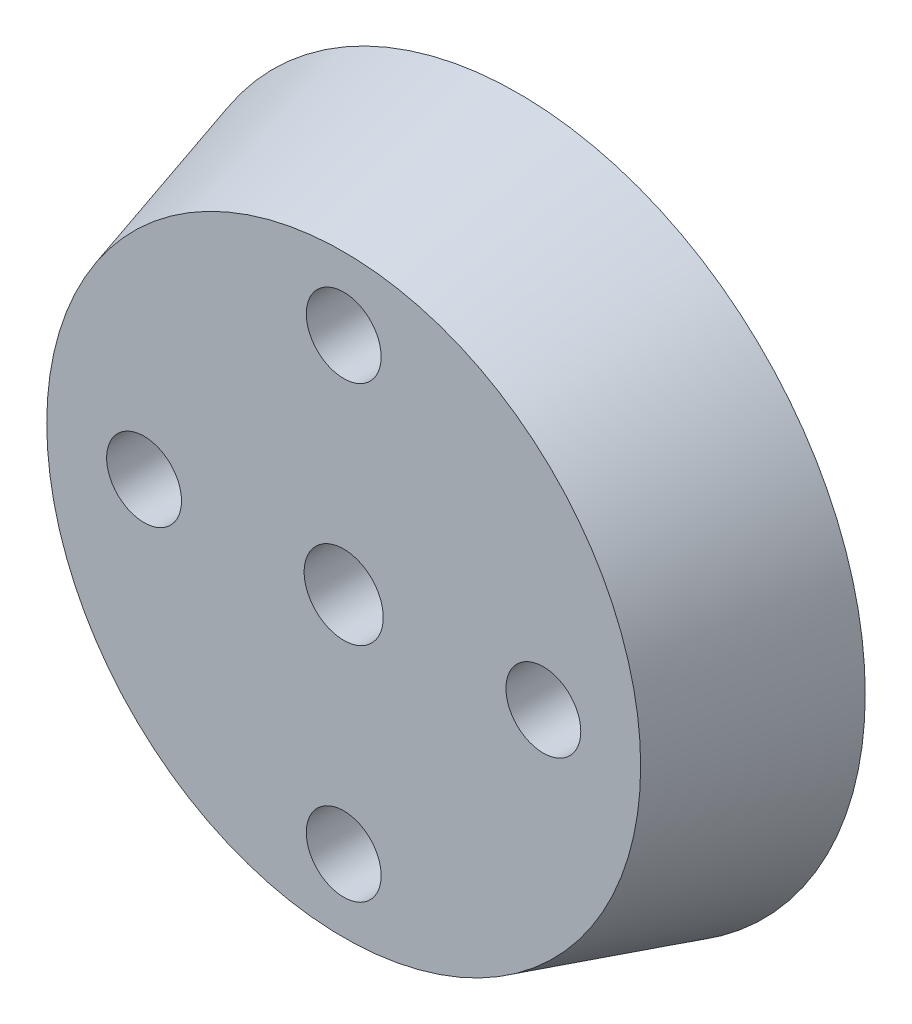
ISO-10303-21;
HEADER;
FILE_DESCRIPTION(('STEP AP214'),'2;1');
FILE_NAME('part.step','',(''),(''),'','','');
FILE_SCHEMA(('AUTOMOTIVE_DESIGN { 1 0 10303 214 1 1 1 1 }'));
ENDSEC;
DATA;
#1=APPLICATION_CONTEXT('core data for automotive mechanical design processes');
#2=APPLICATION_PROTOCOL_DEFINITION('international standard','automotive_design',2000,#1);
#3=PRODUCT_CONTEXT('',#1,'mechanical');
#4=PRODUCT('Part','Part','',(#3));
#5=PRODUCT_RELATED_PRODUCT_CATEGORY('part','',(#4));
#6=PRODUCT_DEFINITION_FORMATION('','',#4);
#7=PRODUCT_DEFINITION_CONTEXT('part definition',#1,'design');
#8=PRODUCT_DEFINITION('design','',#6,#7);
#9=PRODUCT_DEFINITION_SHAPE('','',#8);
#10=(LENGTH_UNIT() NAMED_UNIT(*) SI_UNIT(.MILLI.,.METRE.));
#11=(NAMED_UNIT(*) PLANE_ANGLE_UNIT() SI_UNIT($,.RADIAN.));
#12=(NAMED_UNIT(*) SI_UNIT($,.STERADIAN.) SOLID_ANGLE_UNIT());
#13=UNCERTAINTY_MEASURE_WITH_UNIT(LENGTH_MEASURE(1.E-05),#10,'distance_accuracy_value','');
#14=(GEOMETRIC_REPRESENTATION_CONTEXT(3) GLOBAL_UNCERTAINTY_ASSIGNED_CONTEXT((#13)) GLOBAL_UNIT_ASSIGNED_CONTEXT((#10,
#11,#12)) REPRESENTATION_CONTEXT('',''));
#15=CARTESIAN_POINT('',(0.,0.,0.));
#16=DIRECTION('',(0.,0.,1.));
#17=DIRECTION('',(1.,0.,0.));
#18=AXIS2_PLACEMENT_3D('',#15,#16,#17);
#19=CARTESIAN_POINT('',(0.,0.,7.));
#20=DIRECTION('',(0.,0.,1.));
#21=DIRECTION('',(1.,0.,0.));
#22=AXIS2_PLACEMENT_3D('',#19,#20,#21);
#23=PLANE('',#22);
#24=CARTESIAN_POINT('',(0.,0.,7.));
#25=DIRECTION('',(0.,0.,1.));
#26=DIRECTION('',(1.,0.,0.));
#27=AXIS2_PLACEMENT_3D('',#24,#25,#26);
#28=CIRCLE('',#27,11.9);
#29=CARTESIAN_POINT('',(11.9,0.,7.));
#30=VERTEX_POINT('',#29);
#31=EDGE_CURVE('E10',#30,#30,#28,.T.);
#32=ORIENTED_EDGE('',*,*,#31,.T.);
#33=EDGE_LOOP('',(#32));
#34=FACE_BOUND('',#33,.T.);
#35=CARTESIAN_POINT('',(-8.,0.,7.));
#36=DIRECTION('',(0.,0.,1.));
#37=DIRECTION('',(1.,0.,0.));
#38=AXIS2_PLACEMENT_3D('',#35,#36,#37);
#39=CIRCLE('',#38,1.5);
#40=CARTESIAN_POINT('',(-6.5,0.,7.));
#41=VERTEX_POINT('',#40);
#42=EDGE_CURVE('E81',#41,#41,#39,.T.);
#43=ORIENTED_EDGE('',*,*,#42,.F.);
#44=EDGE_LOOP('',(#43));
#45=FACE_BOUND('',#44,.T.);
#46=CARTESIAN_POINT('',(8.,0.,7.));
#47=DIRECTION('',(0.,0.,1.));
#48=DIRECTION('',(1.,0.,0.));
#49=AXIS2_PLACEMENT_3D('',#46,#47,#48);
#50=CIRCLE('',#49,1.5);
#51=CARTESIAN_POINT('',(9.5,0.,7.));
#52=VERTEX_POINT('',#51);
#53=EDGE_CURVE('E78',#52,#52,#50,.T.);
#54=ORIENTED_EDGE('',*,*,#53,.F.);
#55=EDGE_LOOP('',(#54));
#56=FACE_BOUND('',#55,.T.);
#57=CARTESIAN_POINT('',(0.,-9.,7.));
#58=DIRECTION('',(0.,0.,1.));
#59=DIRECTION('',(1.,0.,0.));
#60=AXIS2_PLACEMENT_3D('',#57,#58,#59);
#61=CIRCLE('',#60,1.5);
#62=CARTESIAN_POINT('',(1.5,-9.,7.));
#63=VERTEX_POINT('',#62);
#64=EDGE_CURVE('E72',#63,#63,#61,.T.);
#65=ORIENTED_EDGE('',*,*,#64,.F.);
#66=EDGE_LOOP('',(#65));
#67=FACE_BOUND('',#66,.T.);
#68=CARTESIAN_POINT('',(0.,9.,7.));
#69=DIRECTION('',(0.,0.,1.));
#70=DIRECTION('',(1.,0.,0.));
#71=AXIS2_PLACEMENT_3D('',#68,#69,#70);
#72=CIRCLE('',#71,1.5);
#73=CARTESIAN_POINT('',(1.5,9.,7.));
#74=VERTEX_POINT('',#73);
#75=EDGE_CURVE('E65',#74,#74,#72,.T.);
#76=ORIENTED_EDGE('',*,*,#75,.F.);
#77=EDGE_LOOP('',(#76));
#78=FACE_BOUND('',#77,.T.);
#79=CARTESIAN_POINT('',(0.,0.,7.));
#80=DIRECTION('',(0.,0.,1.));
#81=DIRECTION('',(1.,0.,0.));
#82=AXIS2_PLACEMENT_3D('',#79,#80,#81);
#83=CIRCLE('',#82,1.585);
#84=CARTESIAN_POINT('',(1.585,0.,7.));
#85=VERTEX_POINT('',#84);
#86=EDGE_CURVE('E59',#85,#85,#83,.T.);
#87=ORIENTED_EDGE('',*,*,#86,.F.);
#88=EDGE_LOOP('',(#87));
#89=FACE_BOUND('',#88,.T.);
#90=ADVANCED_FACE('F43',(#34,#45,#56,#67,#78,#89),#23,.T.);
#91=CARTESIAN_POINT('',(0.,0.,0.));
#92=DIRECTION('',(0.,0.,1.));
#93=DIRECTION('',(1.,0.,0.));
#94=AXIS2_PLACEMENT_3D('',#91,#92,#93);
#95=PLANE('',#94);
#96=CARTESIAN_POINT('',(-8.,0.,0.));
#97=DIRECTION('',(0.,0.,1.));
#98=DIRECTION('',(1.,0.,0.));
#99=AXIS2_PLACEMENT_3D('',#96,#97,#98);
#100=CIRCLE('',#99,1.5);
#101=CARTESIAN_POINT('',(-6.5,0.,0.));
#102=VERTEX_POINT('',#101);
#103=EDGE_CURVE('E64',#102,#102,#100,.F.);
#104=ORIENTED_EDGE('',*,*,#103,.F.);
#105=EDGE_LOOP('',(#104));
#106=FACE_BOUND('',#105,.T.);
#107=CARTESIAN_POINT('',(8.,0.,0.));
#108=DIRECTION('',(0.,0.,1.));
#109=DIRECTION('',(1.,0.,0.));
#110=AXIS2_PLACEMENT_3D('',#107,#108,#109);
#111=CIRCLE('',#110,1.5);
#112=CARTESIAN_POINT('',(9.5,0.,0.));
#113=VERTEX_POINT('',#112);
#114=EDGE_CURVE('E75',#113,#113,#111,.F.);
#115=ORIENTED_EDGE('',*,*,#114,.F.);
#116=EDGE_LOOP('',(#115));
#117=FACE_BOUND('',#116,.T.);
#118=CARTESIAN_POINT('',(0.,-9.,0.));
#119=DIRECTION('',(0.,0.,1.));
#120=DIRECTION('',(1.,0.,0.));
#121=AXIS2_PLACEMENT_3D('',#118,#119,#120);
#122=CIRCLE('',#121,1.5);
#123=CARTESIAN_POINT('',(1.5,-9.,0.));
#124=VERTEX_POINT('',#123);
#125=EDGE_CURVE('E68',#124,#124,#122,.F.);
#126=ORIENTED_EDGE('',*,*,#125,.F.);
#127=EDGE_LOOP('',(#126));
#128=FACE_BOUND('',#127,.T.);
#129=CARTESIAN_POINT('',(0.,9.,0.));
#130=DIRECTION('',(0.,0.,1.));
#131=DIRECTION('',(1.,0.,0.));
#132=AXIS2_PLACEMENT_3D('',#129,#130,#131);
#133=CIRCLE('',#132,1.5);
#134=CARTESIAN_POINT('',(1.5,9.,0.));
#135=VERTEX_POINT('',#134);
#136=EDGE_CURVE('E69',#135,#135,#133,.F.);
#137=ORIENTED_EDGE('',*,*,#136,.F.);
#138=EDGE_LOOP('',(#137));
#139=FACE_BOUND('',#138,.T.);
#140=CARTESIAN_POINT('',(0.,0.,0.));
#141=DIRECTION('',(0.,0.,1.));
#142=DIRECTION('',(1.,0.,0.));
#143=AXIS2_PLACEMENT_3D('',#140,#141,#142);
#144=CIRCLE('',#143,1.585);
#145=CARTESIAN_POINT('',(1.585,0.,0.));
#146=VERTEX_POINT('',#145);
#147=EDGE_CURVE('E55',#146,#146,#144,.F.);
#148=ORIENTED_EDGE('',*,*,#147,.F.);
#149=EDGE_LOOP('',(#148));
#150=FACE_BOUND('',#149,.T.);
#151=CARTESIAN_POINT('',(0.,0.,0.));
#152=DIRECTION('',(0.,0.,1.));
#153=DIRECTION('',(1.,0.,0.));
#154=AXIS2_PLACEMENT_3D('',#151,#152,#153);
#155=CIRCLE('',#154,13.9);
#156=CARTESIAN_POINT('',(13.9,0.,0.));
#157=VERTEX_POINT('',#156);
#158=EDGE_CURVE('E51',#157,#157,#155,.T.);
#159=ORIENTED_EDGE('',*,*,#158,.F.);
#160=EDGE_LOOP('',(#159));
#161=FACE_BOUND('',#160,.T.);
#162=ADVANCED_FACE('F94',(#106,#117,#128,#139,#150,#161),#95,.F.);
#163=CARTESIAN_POINT('',(0.,0.,-0.00100000000000013));
#164=DIRECTION('',(0.,0.,1.));
#165=DIRECTION('',(1.,0.,0.));
#166=AXIS2_PLACEMENT_3D('',#163,#164,#165);
#167=CYLINDRICAL_SURFACE('',#166,1.585);
#168=ORIENTED_EDGE('',*,*,#86,.T.);
#169=EDGE_LOOP('',(#168));
#170=FACE_BOUND('',#169,.T.);
#171=ORIENTED_EDGE('',*,*,#147,.T.);
#172=EDGE_LOOP('',(#171));
#173=FACE_BOUND('',#172,.T.);
#174=ADVANCED_FACE('F104',(#170,#173),#167,.F.);
#175=CARTESIAN_POINT('',(0.,9.,-0.00100000000000013));
#176=DIRECTION('',(0.,0.,1.));
#177=DIRECTION('',(1.,0.,0.));
#178=AXIS2_PLACEMENT_3D('',#175,#176,#177);
#179=CYLINDRICAL_SURFACE('',#178,1.5);
#180=ORIENTED_EDGE('',*,*,#75,.T.);
#181=EDGE_LOOP('',(#180));
#182=FACE_BOUND('',#181,.T.);
#183=ORIENTED_EDGE('',*,*,#136,.T.);
#184=EDGE_LOOP('',(#183));
#185=FACE_BOUND('',#184,.T.);
#186=ADVANCED_FACE('F107',(#182,#185),#179,.F.);
#187=CARTESIAN_POINT('',(0.,-9.,-0.00100000000000013));
#188=DIRECTION('',(0.,0.,1.));
#189=DIRECTION('',(1.,0.,0.));
#190=AXIS2_PLACEMENT_3D('',#187,#188,#189);
#191=CYLINDRICAL_SURFACE('',#190,1.5);
#192=ORIENTED_EDGE('',*,*,#64,.T.);
#193=EDGE_LOOP('',(#192));
#194=FACE_BOUND('',#193,.T.);
#195=ORIENTED_EDGE('',*,*,#125,.T.);
#196=EDGE_LOOP('',(#195));
#197=FACE_BOUND('',#196,.T.);
#198=ADVANCED_FACE('F121',(#194,#197),#191,.F.);
#199=CARTESIAN_POINT('',(8.,0.,-0.00100000000000013));
#200=DIRECTION('',(0.,0.,1.));
#201=DIRECTION('',(1.,0.,0.));
#202=AXIS2_PLACEMENT_3D('',#199,#200,#201);
#203=CYLINDRICAL_SURFACE('',#202,1.5);
#204=ORIENTED_EDGE('',*,*,#53,.T.);
#205=EDGE_LOOP('',(#204));
#206=FACE_BOUND('',#205,.T.);
#207=ORIENTED_EDGE('',*,*,#114,.T.);
#208=EDGE_LOOP('',(#207));
#209=FACE_BOUND('',#208,.T.);
#210=ADVANCED_FACE('F125',(#206,#209),#203,.F.);
#211=CARTESIAN_POINT('',(-8.,0.,-0.00100000000000013));
#212=DIRECTION('',(0.,0.,1.));
#213=DIRECTION('',(1.,0.,0.));
#214=AXIS2_PLACEMENT_3D('',#211,#212,#213);
#215=CYLINDRICAL_SURFACE('',#214,1.5);
#216=ORIENTED_EDGE('',*,*,#42,.T.);
#217=EDGE_LOOP('',(#216));
#218=FACE_BOUND('',#217,.T.);
#219=ORIENTED_EDGE('',*,*,#103,.T.);
#220=EDGE_LOOP('',(#219));
#221=FACE_BOUND('',#220,.T.);
#222=ADVANCED_FACE('F89',(#218,#221),#215,.F.);
#223=CARTESIAN_POINT('',(0.,0.,7.));
#224=DIRECTION('',(0.,0.,-1.));
#225=DIRECTION('',(-1.,0.,0.));
#226=AXIS2_PLACEMENT_3D('',#223,#224,#225);
#227=CONICAL_SURFACE('',#226,11.9,0.278299659005108);
#228=ORIENTED_EDGE('',*,*,#158,.T.);
#229=EDGE_LOOP('',(#228));
#230=FACE_BOUND('',#229,.T.);
#231=ORIENTED_EDGE('',*,*,#31,.F.);
#232=EDGE_LOOP('',(#231));
#233=FACE_BOUND('',#232,.T.);
#234=ADVANCED_FACE('F46',(#230,#233),#227,.T.);
#235=CLOSED_SHELL('',(#90,#162,#174,#186,#198,#210,#222,#234));
#236=MANIFOLD_SOLID_BREP('B2',#235);
#237=ADVANCED_BREP_SHAPE_REPRESENTATION('',(#18,#236),#14);
#238=SHAPE_DEFINITION_REPRESENTATION(#9,#237);
ENDSEC;
END-ISO-10303-21;
